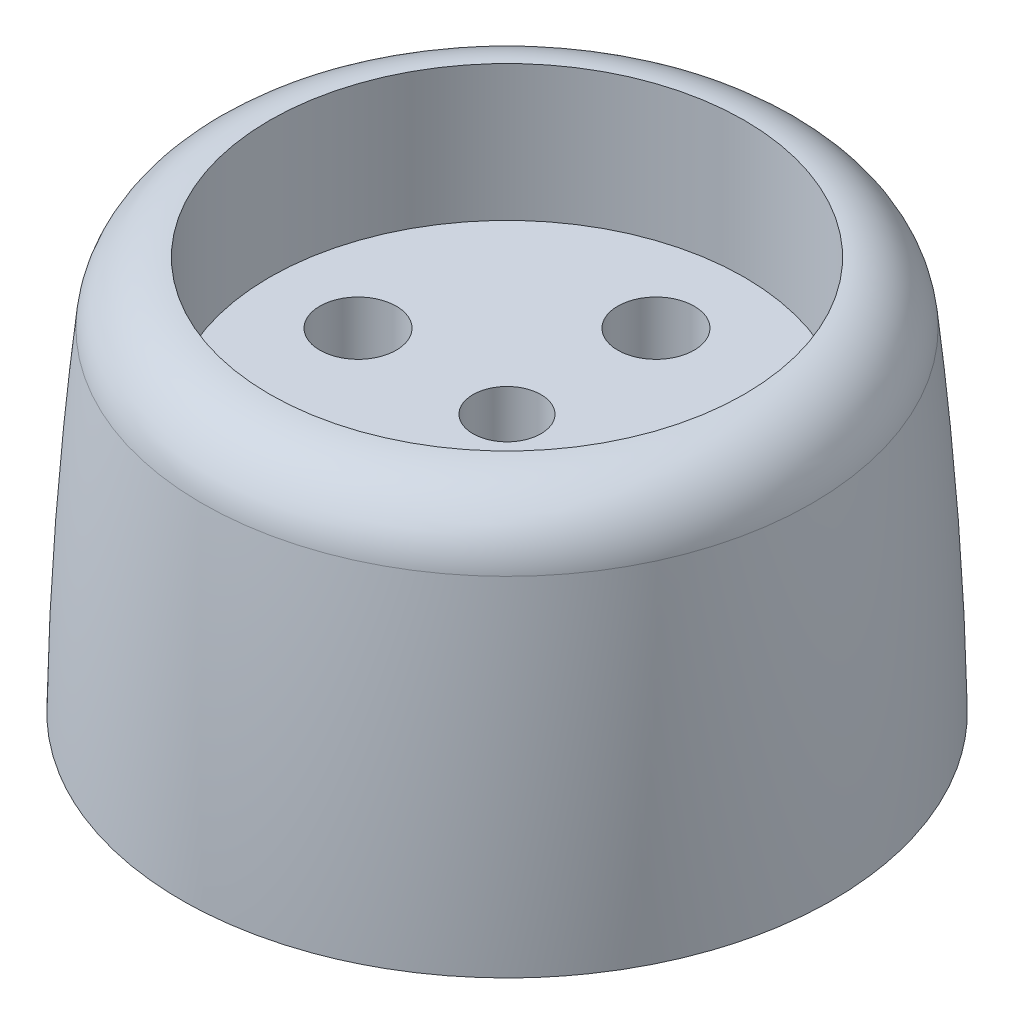
ISO-10303-21;
HEADER;
FILE_DESCRIPTION(('STEP AP214'),'2;1');
FILE_NAME('part.step','',(''),(''),'','','');
FILE_SCHEMA(('AUTOMOTIVE_DESIGN { 1 0 10303 214 1 1 1 1 }'));
ENDSEC;
DATA;
#1=APPLICATION_CONTEXT('core data for automotive mechanical design processes');
#2=APPLICATION_PROTOCOL_DEFINITION('international standard','automotive_design',2000,#1);
#3=PRODUCT_CONTEXT('',#1,'mechanical');
#4=PRODUCT('Part','Part','',(#3));
#5=PRODUCT_RELATED_PRODUCT_CATEGORY('part','',(#4));
#6=PRODUCT_DEFINITION_FORMATION('','',#4);
#7=PRODUCT_DEFINITION_CONTEXT('part definition',#1,'design');
#8=PRODUCT_DEFINITION('design','',#6,#7);
#9=PRODUCT_DEFINITION_SHAPE('','',#8);
#10=(LENGTH_UNIT() NAMED_UNIT(*) SI_UNIT(.MILLI.,.METRE.));
#11=(NAMED_UNIT(*) PLANE_ANGLE_UNIT() SI_UNIT($,.RADIAN.));
#12=(NAMED_UNIT(*) SI_UNIT($,.STERADIAN.) SOLID_ANGLE_UNIT());
#13=UNCERTAINTY_MEASURE_WITH_UNIT(LENGTH_MEASURE(1.E-05),#10,'distance_accuracy_value','');
#14=(GEOMETRIC_REPRESENTATION_CONTEXT(3) GLOBAL_UNCERTAINTY_ASSIGNED_CONTEXT((#13)) GLOBAL_UNIT_ASSIGNED_CONTEXT((#10,
#11,#12)) REPRESENTATION_CONTEXT('',''));
#15=CARTESIAN_POINT('',(0.,0.,0.));
#16=DIRECTION('',(0.,0.,1.));
#17=DIRECTION('',(1.,0.,0.));
#18=AXIS2_PLACEMENT_3D('',#15,#16,#17);
#19=CARTESIAN_POINT('',(0.,-21.59,0.));
#20=DIRECTION('',(0.,1.,0.));
#21=DIRECTION('',(0.,0.,1.));
#22=AXIS2_PLACEMENT_3D('',#19,#20,#21);
#23=CYLINDRICAL_SURFACE('',#22,1.5875);
#24=CARTESIAN_POINT('',(0.,3.17487659075111,0.));
#25=DIRECTION('',(0.,1.,0.));
#26=DIRECTION('',(0.,0.,1.));
#27=AXIS2_PLACEMENT_3D('',#24,#25,#26);
#28=CIRCLE('',#27,1.5875);
#29=CARTESIAN_POINT('',(0.,3.17487659075111,1.58749999999999));
#30=VERTEX_POINT('',#29);
#31=EDGE_CURVE('E859',#30,#30,#28,.F.);
#32=ORIENTED_EDGE('',*,*,#31,.T.);
#33=EDGE_LOOP('',(#32));
#34=FACE_BOUND('',#33,.T.);
#35=CARTESIAN_POINT('',(0.,15.24,0.));
#36=DIRECTION('',(0.,1.,0.));
#37=DIRECTION('',(-1.,0.,0.));
#38=AXIS2_PLACEMENT_3D('',#35,#36,#37);
#39=CIRCLE('',#38,1.5875);
#40=CARTESIAN_POINT('',(-1.5875,15.24,0.));
#41=VERTEX_POINT('',#40);
#42=EDGE_CURVE('E312',#41,#41,#39,.F.);
#43=ORIENTED_EDGE('',*,*,#42,.F.);
#44=EDGE_LOOP('',(#43));
#45=FACE_BOUND('',#44,.T.);
#46=ADVANCED_FACE('F56',(#34,#45),#23,.F.);
#47=CARTESIAN_POINT('',(-6.96215531705922,-21.59,0.));
#48=DIRECTION('',(0.,1.,0.));
#49=DIRECTION('',(0.,0.,1.));
#50=AXIS2_PLACEMENT_3D('',#47,#48,#49);
#51=CYLINDRICAL_SURFACE('',#50,1.7859375);
#52=CARTESIAN_POINT('',(-6.96215531705924,3.17487659075111,0.));
#53=DIRECTION('',(0.,1.,0.));
#54=DIRECTION('',(0.,0.,1.));
#55=AXIS2_PLACEMENT_3D('',#52,#53,#54);
#56=CIRCLE('',#55,1.7859375);
#57=CARTESIAN_POINT('',(-6.96215531705924,3.17487659075111,1.7859375));
#58=VERTEX_POINT('',#57);
#59=EDGE_CURVE('E1285',#58,#58,#56,.F.);
#60=ORIENTED_EDGE('',*,*,#59,.T.);
#61=EDGE_LOOP('',(#60));
#62=FACE_BOUND('',#61,.T.);
#63=CARTESIAN_POINT('',(-6.96215531705924,15.24,0.));
#64=DIRECTION('',(0.,1.,0.));
#65=DIRECTION('',(-1.,0.,0.));
#66=AXIS2_PLACEMENT_3D('',#63,#64,#65);
#67=CIRCLE('',#66,1.7859375);
#68=CARTESIAN_POINT('',(-8.74809281705924,15.24,0.));
#69=VERTEX_POINT('',#68);
#70=EDGE_CURVE('E835',#69,#69,#67,.F.);
#71=ORIENTED_EDGE('',*,*,#70,.F.);
#72=EDGE_LOOP('',(#71));
#73=FACE_BOUND('',#72,.T.);
#74=ADVANCED_FACE('F1273',(#62,#73),#51,.F.);
#75=CARTESIAN_POINT('',(0.,-21.59,6.96215531705923));
#76=DIRECTION('',(0.,1.,0.));
#77=DIRECTION('',(0.,0.,1.));
#78=AXIS2_PLACEMENT_3D('',#75,#76,#77);
#79=CYLINDRICAL_SURFACE('',#78,1.7859375);
#80=CARTESIAN_POINT('',(0.,3.17487659075111,6.96215531705924));
#81=DIRECTION('',(0.,1.,0.));
#82=DIRECTION('',(0.,0.,1.));
#83=AXIS2_PLACEMENT_3D('',#80,#81,#82);
#84=CIRCLE('',#83,1.7859375);
#85=CARTESIAN_POINT('',(0.,3.17487659075111,8.74809281705924));
#86=VERTEX_POINT('',#85);
#87=EDGE_CURVE('E1290',#86,#86,#84,.F.);
#88=ORIENTED_EDGE('',*,*,#87,.T.);
#89=EDGE_LOOP('',(#88));
#90=FACE_BOUND('',#89,.T.);
#91=CARTESIAN_POINT('',(0.,15.24,6.96215531705923));
#92=DIRECTION('',(0.,1.,0.));
#93=DIRECTION('',(-1.,0.,0.));
#94=AXIS2_PLACEMENT_3D('',#91,#92,#93);
#95=CIRCLE('',#94,1.7859375);
#96=CARTESIAN_POINT('',(-1.7859375,15.24,6.96215531705923));
#97=VERTEX_POINT('',#96);
#98=EDGE_CURVE('E841',#97,#97,#95,.F.);
#99=ORIENTED_EDGE('',*,*,#98,.F.);
#100=EDGE_LOOP('',(#99));
#101=FACE_BOUND('',#100,.T.);
#102=ADVANCED_FACE('F1278',(#90,#101),#79,.F.);
#103=CARTESIAN_POINT('',(6.96215531705922,-21.59,0.));
#104=DIRECTION('',(0.,1.,0.));
#105=DIRECTION('',(0.,0.,1.));
#106=AXIS2_PLACEMENT_3D('',#103,#104,#105);
#107=CYLINDRICAL_SURFACE('',#106,1.7859375);
#108=CARTESIAN_POINT('',(6.96215531705924,3.17487659075111,0.));
#109=DIRECTION('',(0.,1.,0.));
#110=DIRECTION('',(0.,0.,1.));
#111=AXIS2_PLACEMENT_3D('',#108,#109,#110);
#112=CIRCLE('',#111,1.7859375);
#113=CARTESIAN_POINT('',(6.96215531705924,3.17487659075111,1.7859375));
#114=VERTEX_POINT('',#113);
#115=EDGE_CURVE('E1296',#114,#114,#112,.F.);
#116=ORIENTED_EDGE('',*,*,#115,.T.);
#117=EDGE_LOOP('',(#116));
#118=FACE_BOUND('',#117,.T.);
#119=CARTESIAN_POINT('',(6.96215531705922,15.24,0.));
#120=DIRECTION('',(0.,1.,0.));
#121=DIRECTION('',(-1.,0.,0.));
#122=AXIS2_PLACEMENT_3D('',#119,#120,#121);
#123=CIRCLE('',#122,1.7859375);
#124=CARTESIAN_POINT('',(5.17621781705922,15.24,0.));
#125=VERTEX_POINT('',#124);
#126=EDGE_CURVE('E847',#125,#125,#123,.F.);
#127=ORIENTED_EDGE('',*,*,#126,.F.);
#128=EDGE_LOOP('',(#127));
#129=FACE_BOUND('',#128,.T.);
#130=ADVANCED_FACE('F1466',(#118,#129),#107,.F.);
#131=CARTESIAN_POINT('',(0.,-21.59,-6.96215531705923));
#132=DIRECTION('',(0.,1.,0.));
#133=DIRECTION('',(0.,0.,1.));
#134=AXIS2_PLACEMENT_3D('',#131,#132,#133);
#135=CYLINDRICAL_SURFACE('',#134,1.7859375);
#136=CARTESIAN_POINT('',(0.,3.17487659075111,-6.96215531705923));
#137=DIRECTION('',(0.,1.,0.));
#138=DIRECTION('',(0.,0.,1.));
#139=AXIS2_PLACEMENT_3D('',#136,#137,#138);
#140=CIRCLE('',#139,1.7859375);
#141=CARTESIAN_POINT('',(0.,3.17487659075111,-5.17621781705923));
#142=VERTEX_POINT('',#141);
#143=EDGE_CURVE('E1299',#142,#142,#140,.F.);
#144=ORIENTED_EDGE('',*,*,#143,.T.);
#145=EDGE_LOOP('',(#144));
#146=FACE_BOUND('',#145,.T.);
#147=CARTESIAN_POINT('',(0.,15.24,-6.96215531705923));
#148=DIRECTION('',(0.,1.,0.));
#149=DIRECTION('',(-1.,0.,0.));
#150=AXIS2_PLACEMENT_3D('',#147,#148,#149);
#151=CIRCLE('',#150,1.7859375);
#152=CARTESIAN_POINT('',(-1.78593750000001,15.24,-6.96215531705923));
#153=VERTEX_POINT('',#152);
#154=EDGE_CURVE('E853',#153,#153,#151,.F.);
#155=ORIENTED_EDGE('',*,*,#154,.F.);
#156=EDGE_LOOP('',(#155));
#157=FACE_BOUND('',#156,.T.);
#158=ADVANCED_FACE('F1474',(#146,#157),#135,.F.);
#159=CARTESIAN_POINT('',(15.2116495254516,3.175,0.));
#160=DIRECTION('',(0.,-1.,0.));
#161=DIRECTION('',(1.,0.,0.));
#162=AXIS2_PLACEMENT_3D('',#159,#160,#161);
#163=PLANE('',#162);
#164=CARTESIAN_POINT('',(-8.9437872692217,3.17487659075111,-9.01657747057653));
#165=CARTESIAN_POINT('',(-8.38318792405415,3.17487659075111,-9.57265113631113));
#166=CARTESIAN_POINT('',(-7.75758972340849,3.17487659075111,-10.0553369751226));
#167=CARTESIAN_POINT('',(-7.13242529113575,3.17487659075111,-10.5376881360997));
#168=CARTESIAN_POINT('',(-6.45181852373652,3.17487659075111,-10.9391058929316));
#169=B_SPLINE_CURVE_WITH_KNOTS('',2,(#164,#165,#166,#167,#168),.UNSPECIFIED.,.F.,.F.,(3,2,3),
(0.,0.5,1.),.UNSPECIFIED.);
#170=CARTESIAN_POINT('',(-8.94441971891657,3.17487659840805,-9.01595190643541));
#171=VERTEX_POINT('',#170);
#172=CARTESIAN_POINT('',(-6.45181852373651,3.17487659075111,-10.9391058929316));
#173=VERTEX_POINT('',#172);
#174=EDGE_CURVE('E603',#171,#173,#169,.T.);
#175=ORIENTED_EDGE('',*,*,#174,.F.);
#176=DIRECTION('',(-0.771561141497439,0.,-0.636155173626034));
#177=VECTOR('',#176,1.);
#178=CARTESIAN_POINT('',(-8.94179219241481,3.17499999999999,-9.01855600346696));
#179=LINE('',#178,#177);
#180=CARTESIAN_POINT('',(-10.8907253794166,3.17493829537555,-10.6200932290842));
#181=VERTEX_POINT('',#180);
#182=EDGE_CURVE('E283',#171,#181,#179,.T.);
#183=ORIENTED_EDGE('',*,*,#182,.T.);
#184=CARTESIAN_POINT('',(0.,3.175,0.));
#185=DIRECTION('',(0.,-1.,0.));
#186=DIRECTION('',(1.,0.,0.));
#187=AXIS2_PLACEMENT_3D('',#184,#185,#186);
#188=CIRCLE('',#187,15.2116495254516);
#189=CARTESIAN_POINT('',(-7.51043778140779,3.1748851959031,-13.2282868209953));
#190=VERTEX_POINT('',#189);
#191=EDGE_CURVE('E281',#181,#190,#188,.T.);
#192=ORIENTED_EDGE('',*,*,#191,.T.);
#193=DIRECTION('',(0.419135182780614,0.,0.90792383962283));
#194=VECTOR('',#193,1.);
#195=CARTESIAN_POINT('',(-6.44939814103546,3.17499999999999,-10.9405330591525));
#196=LINE('',#195,#194);
#197=EDGE_CURVE('E299',#190,#173,#196,.T.);
#198=ORIENTED_EDGE('',*,*,#197,.T.);
#199=EDGE_LOOP('',(#175,#183,#192,#198));
#200=FACE_BOUND('',#199,.T.);
#201=ADVANCED_FACE('F395',(#200),#163,.T.);
#202=DIRECTION('',(0.771561141497439,0.,0.636155173626034));
#203=VECTOR('',#202,1.);
#204=CARTESIAN_POINT('',(-10.5576263334249,3.17499999999999,-7.05879070406347));
#205=LINE('',#204,#203);
#206=CARTESIAN_POINT('',(-12.5062091733793,3.17488519590341,-8.65961777439389));
#207=VERTEX_POINT('',#206);
#208=CARTESIAN_POINT('',(-10.5596807089745,3.17487659075111,-7.05571420539032));
#209=VERTEX_POINT('',#208);
#210=EDGE_CURVE('E257',#207,#209,#205,.T.);
#211=ORIENTED_EDGE('',*,*,#210,.T.);
#212=CARTESIAN_POINT('',(-11.9702202376876,3.17487659075111,-4.24309173377785));
#213=CARTESIAN_POINT('',(-11.7064090016404,3.17487659075111,-4.987331734889));
#214=CARTESIAN_POINT('',(-11.352194035604,3.17487659075111,-5.69365353512118));
#215=CARTESIAN_POINT('',(-10.9982246701013,3.17487659075111,-6.39948559599223));
#216=CARTESIAN_POINT('',(-10.5591877986707,3.17487659075111,-7.05645470703267));
#217=B_SPLINE_CURVE_WITH_KNOTS('',2,(#212,#213,#214,#215,#216),.UNSPECIFIED.,.F.,.F.,(3,2,3),
(0.,0.5,1.),.UNSPECIFIED.);
#218=CARTESIAN_POINT('',(-11.9702202376876,3.17487659075111,-4.24309173377786));
#219=VERTEX_POINT('',#218);
#220=EDGE_CURVE('E74',#219,#209,#217,.T.);
#221=ORIENTED_EDGE('',*,*,#220,.F.);
#222=DIRECTION('',(-0.971169953564289,0.,-0.238388173561394));
#223=VECTOR('',#222,1.);
#224=CARTESIAN_POINT('',(-11.969281188844,3.17499999999999,-4.24573996170106));
#225=LINE('',#224,#223);
#226=CARTESIAN_POINT('',(-14.4200902757408,3.17493829537555,-4.84306472430372));
#227=VERTEX_POINT('',#226);
#228=EDGE_CURVE('E269',#219,#227,#225,.T.);
#229=ORIENTED_EDGE('',*,*,#228,.T.);
#230=EDGE_CURVE('E279',#227,#207,#188,.T.);
#231=ORIENTED_EDGE('',*,*,#230,.T.);
#232=EDGE_LOOP('',(#211,#221,#229,#231));
#233=FACE_BOUND('',#232,.T.);
#234=ADVANCED_FACE('F288',(#233),#163,.T.);
#235=CARTESIAN_POINT('',(-12.6258042829624,3.17487659075111,1.37079035900065));
#236=CARTESIAN_POINT('',(-12.7110322067656,3.17487659075111,0.585789882219289));
#237=CARTESIAN_POINT('',(-12.698357093525,3.17487659075111,-0.204272184410827));
#238=CARTESIAN_POINT('',(-12.6856907687736,3.17487659075111,-0.993786449075516));
#239=CARTESIAN_POINT('',(-12.5751804301384,3.17487659075111,-1.77618612466817));
#240=B_SPLINE_CURVE_WITH_KNOTS('',2,(#235,#236,#237,#238,#239),.UNSPECIFIED.,.F.,.F.,(3,2,3),
(0.,0.5,1.),.UNSPECIFIED.);
#241=CARTESIAN_POINT('',(-12.6258042829624,3.17487659075111,1.37079035900065));
#242=VERTEX_POINT('',#241);
#243=CARTESIAN_POINT('',(-12.5753032353554,3.17487659075111,-1.7753050899761));
#244=VERTEX_POINT('',#243);
#245=EDGE_CURVE('E1161',#242,#244,#240,.T.);
#246=ORIENTED_EDGE('',*,*,#245,.F.);
#247=DIRECTION('',(-0.978426645709885,0.,0.206594527916166));
#248=VECTOR('',#247,1.);
#249=CARTESIAN_POINT('',(-12.6261072522222,3.17499999999999,1.36799695006323));
#250=LINE('',#249,#248);
#251=CARTESIAN_POINT('',(-15.0933794421539,3.17493829537555,1.89319214541851));
#252=VERTEX_POINT('',#251);
#253=EDGE_CURVE('E807',#242,#252,#250,.T.);
#254=ORIENTED_EDGE('',*,*,#253,.T.);
#255=CARTESIAN_POINT('',(-15.0248149332712,3.1748851959031,-2.37680850436307));
#256=VERTEX_POINT('',#255);
#257=EDGE_CURVE('E291',#252,#256,#188,.T.);
#258=ORIENTED_EDGE('',*,*,#257,.T.);
#259=DIRECTION('',(0.971169953564289,0.,0.238388173561394));
#260=VECTOR('',#259,1.);
#261=CARTESIAN_POINT('',(-12.5747871496899,3.17499999999999,-1.77896827964777));
#262=LINE('',#261,#260);
#263=EDGE_CURVE('E812',#256,#244,#262,.T.);
#264=ORIENTED_EDGE('',*,*,#263,.T.);
#265=EDGE_LOOP('',(#246,#254,#258,#264));
#266=FACE_BOUND('',#265,.T.);
#267=ADVANCED_FACE('F1166',(#266),#163,.T.);
#268=CARTESIAN_POINT('',(-10.7806929446686,3.17487659075111,6.71317060953857));
#269=CARTESIAN_POINT('',(-11.198079592762,3.17487659075111,6.04288862893386));
#270=CARTESIAN_POINT('',(-11.5294547939437,3.17487659075111,5.32556777765602));
#271=CARTESIAN_POINT('',(-11.8606002309089,3.17487659075111,4.60874429209195));
#272=CARTESIAN_POINT('',(-12.1005043529502,3.17487659075111,3.85587790318016));
#273=B_SPLINE_CURVE_WITH_KNOTS('',2,(#268,#269,#270,#271,#272),.UNSPECIFIED.,.F.,.F.,(3,2,3),
(0.,0.5,1.),.UNSPECIFIED.);
#274=CARTESIAN_POINT('',(-10.7806929446686,3.17487659075111,6.71317060953858));
#275=VERTEX_POINT('',#274);
#276=CARTESIAN_POINT('',(-12.100232730001,3.17487659075111,3.85672497119596));
#277=VERTEX_POINT('',#276);
#278=EDGE_CURVE('E1252',#275,#277,#273,.T.);
#279=ORIENTED_EDGE('',*,*,#278,.F.);
#280=DIRECTION('',(-0.791893941057303,0.,0.610658649424318));
#281=VECTOR('',#280,1.);
#282=CARTESIAN_POINT('',(-10.7821779252543,3.17499999999999,6.71078528848594));
#283=LINE('',#282,#281);
#284=CARTESIAN_POINT('',(-12.7772397018969,3.17493829537555,8.2544790922613));
#285=VERTEX_POINT('',#284);
#286=EDGE_CURVE('E791',#275,#285,#283,.T.);
#287=ORIENTED_EDGE('',*,*,#286,.T.);
#288=CARTESIAN_POINT('',(-14.5681490619122,3.1748851959031,4.37759241540021));
#289=VERTEX_POINT('',#288);
#290=EDGE_CURVE('E297',#285,#289,#188,.T.);
#291=ORIENTED_EDGE('',*,*,#290,.T.);
#292=DIRECTION('',(0.978426645709885,0.,-0.206594527916166));
#293=VECTOR('',#292,1.);
#294=CARTESIAN_POINT('',(-12.1013571513151,3.17499999999999,3.85320063016637));
#295=LINE('',#294,#293);
#296=EDGE_CURVE('E378',#289,#277,#295,.T.);
#297=ORIENTED_EDGE('',*,*,#296,.T.);
#298=EDGE_LOOP('',(#279,#287,#291,#297));
#299=FACE_BOUND('',#298,.T.);
#300=ADVANCED_FACE('F1237',(#299),#163,.T.);
#301=CARTESIAN_POINT('',(-6.80033315216099,3.17487659075111,10.7259250892229));
#302=CARTESIAN_POINT('',(-7.4672099799845,3.17487659075111,10.3031191715111));
#303=CARTESIAN_POINT('',(-8.07700257293823,3.17487659075111,9.80061372755551));
#304=CARTESIAN_POINT('',(-8.68637235659993,3.17487659075111,9.29845670365854));
#305=CARTESIAN_POINT('',(-9.22917498571327,3.17487659075111,8.72423802306452));
#306=B_SPLINE_CURVE_WITH_KNOTS('',2,(#301,#302,#303,#304,#305),.UNSPECIFIED.,.F.,.F.,(3,2,3),
(0.,0.5,1.),.UNSPECIFIED.);
#307=CARTESIAN_POINT('',(-6.80033315216098,3.17487659075111,10.7259250892229));
#308=VERTEX_POINT('',#307);
#309=CARTESIAN_POINT('',(-9.22856273285427,3.17487659075111,8.72488335219496));
#310=VERTEX_POINT('',#309);
#311=EDGE_CURVE('E1239',#308,#310,#306,.T.);
#312=ORIENTED_EDGE('',*,*,#311,.F.);
#313=DIRECTION('',(-0.448516929436481,0.,0.893774336177131));
#314=VECTOR('',#313,1.);
#315=CARTESIAN_POINT('',(-6.80270602545542,3.17499999999999,10.7244202981435));
#316=LINE('',#315,#314);
#317=CARTESIAN_POINT('',(-7.93041093611782,3.17493829537556,12.9808652203392));
#318=VERTEX_POINT('',#317);
#319=EDGE_CURVE('E773',#308,#318,#316,.T.);
#320=ORIENTED_EDGE('',*,*,#319,.T.);
#321=CARTESIAN_POINT('',(-11.2260826022182,3.1748851959031,10.2649574696457));
#322=VERTEX_POINT('',#321);
#323=EDGE_CURVE('E361',#318,#322,#188,.T.);
#324=ORIENTED_EDGE('',*,*,#323,.T.);
#325=DIRECTION('',(0.791893941057303,0.,-0.610658649424319));
#326=VECTOR('',#325,1.);
#327=CARTESIAN_POINT('',(-9.23110495571652,3.17499999999999,8.7221958987715));
#328=LINE('',#327,#326);
#329=EDGE_CURVE('E779',#322,#310,#328,.T.);
#330=ORIENTED_EDGE('',*,*,#329,.T.);
#331=EDGE_LOOP('',(#312,#320,#324,#330));
#332=FACE_BOUND('',#331,.T.);
#333=ADVANCED_FACE('F1240',(#332),#163,.T.);
#334=CARTESIAN_POINT('',(-1.47308397825492,3.17487659075111,12.614278560148));
#335=CARTESIAN_POINT('',(-2.25736785134257,3.17487659075111,12.5226906027123));
#336=CARTESIAN_POINT('',(-3.02480093442641,3.17487659075111,12.3345279320732));
#337=CARTESIAN_POINT('',(-3.79170190569422,3.17487659075111,12.1464957269855));
#338=CARTESIAN_POINT('',(-4.52989432415259,3.17487659075111,11.8646558067232));
#339=B_SPLINE_CURVE_WITH_KNOTS('',2,(#334,#335,#336,#337,#338),.UNSPECIFIED.,.F.,.F.,(3,2,3),
(0.,0.5,1.),.UNSPECIFIED.);
#340=CARTESIAN_POINT('',(-1.47308397825492,3.17487659075111,12.614278560148));
#341=VERTEX_POINT('',#340);
#342=CARTESIAN_POINT('',(-4.52906270557128,3.17487659075111,11.8649715816195));
#343=VERTEX_POINT('',#342);
#344=EDGE_CURVE('E1302',#341,#343,#339,.T.);
#345=ORIENTED_EDGE('',*,*,#344,.F.);
#346=DIRECTION('',(-0.0163056392416079,0.,0.999867054227172));
#347=VECTOR('',#346,1.);
#348=CARTESIAN_POINT('',(-1.47587476760079,3.17499999999999,12.6139523413702));
#349=LINE('',#348,#347);
#350=CARTESIAN_POINT('',(-1.5128670243332,3.17493829537555,15.1362317916645));
#351=VERTEX_POINT('',#350);
#352=EDGE_CURVE('E756',#341,#351,#349,.T.);
#353=ORIENTED_EDGE('',*,*,#352,.T.);
#354=CARTESIAN_POINT('',(-5.66055280428693,3.1748851959031,14.1192218055862));
#355=VERTEX_POINT('',#354);
#356=EDGE_CURVE('E356',#351,#355,#188,.T.);
#357=ORIENTED_EDGE('',*,*,#356,.T.);
#358=DIRECTION('',(0.448516929436481,0.,-0.893774336177131));
#359=VECTOR('',#358,1.);
#360=CARTESIAN_POINT('',(-4.53251921156551,3.17499999999999,11.8636532989122));
#361=LINE('',#360,#359);
#362=EDGE_CURVE('E761',#355,#343,#361,.T.);
#363=ORIENTED_EDGE('',*,*,#362,.T.);
#364=EDGE_LOOP('',(#345,#353,#357,#363));
#365=FACE_BOUND('',#364,.T.);
#366=ADVANCED_FACE('F1315',(#365),#163,.T.);
#367=CARTESIAN_POINT('',(4.14592754373402,3.17487659075111,12.0042194582617));
#368=CARTESIAN_POINT('',(3.39957366505523,3.17487659075111,12.2619895793217));
#369=CARTESIAN_POINT('',(2.62649962589758,3.17487659075111,12.4254376065859));
#370=CARTESIAN_POINT('',(1.85396160980473,3.17487659075111,12.5887723045854));
#371=CARTESIAN_POINT('',(1.06658746381457,3.17487659075111,12.655132997406));
#372=B_SPLINE_CURVE_WITH_KNOTS('',2,(#367,#368,#369,#370,#371),.UNSPECIFIED.,.F.,.F.,(3,2,3),
(0.,0.5,1.),.UNSPECIFIED.);
#373=CARTESIAN_POINT('',(4.14676878332822,3.17487659840805,12.003930254084));
#374=VERTEX_POINT('',#373);
#375=CARTESIAN_POINT('',(1.06658746381458,3.17487659075111,12.655132997406));
#376=VERTEX_POINT('',#375);
#377=EDGE_CURVE('E1247',#374,#376,#372,.T.);
#378=ORIENTED_EDGE('',*,*,#377,.F.);
#379=DIRECTION('',(0.419135182780614,0.,0.90792383962283));
#380=VECTOR('',#379,1.);
#381=CARTESIAN_POINT('',(4.14327158839348,3.17499999999999,12.0051364234153));
#382=LINE('',#381,#380);
#383=CARTESIAN_POINT('',(5.20431875571716,3.17493829537556,14.2936820229498));
#384=VERTEX_POINT('',#383);
#385=EDGE_CURVE('E740',#374,#384,#382,.T.);
#386=ORIENTED_EDGE('',*,*,#385,.T.);
#387=CARTESIAN_POINT('',(1.02713207735344,3.17488519590311,15.1769314284076));
#388=VERTEX_POINT('',#387);
#389=EDGE_CURVE('E351',#384,#388,#188,.T.);
#390=ORIENTED_EDGE('',*,*,#389,.T.);
#391=DIRECTION('',(0.0163056392416076,0.,-0.999867054227172));
#392=VECTOR('',#391,1.);
#393=CARTESIAN_POINT('',(1.06378755013622,3.17499999999999,12.6553686650439));
#394=LINE('',#393,#392);
#395=EDGE_CURVE('E746',#388,#376,#394,.T.);
#396=ORIENTED_EDGE('',*,*,#395,.T.);
#397=EDGE_LOOP('',(#378,#386,#390,#396));
#398=FACE_BOUND('',#397,.T.);
#399=ADVANCED_FACE('F1312',(#398),#163,.T.);
#400=CARTESIAN_POINT('',(8.94378726922175,3.17487659075111,9.01657747057646));
#401=CARTESIAN_POINT('',(8.38318792405061,3.17487659075111,9.57265113631463));
#402=CARTESIAN_POINT('',(7.75758972340851,3.17487659075111,10.0553369751225));
#403=CARTESIAN_POINT('',(7.1324252911314,3.17487659075111,10.5376881361023));
#404=CARTESIAN_POINT('',(6.45181852373651,3.17487659075111,10.9391058929316));
#405=B_SPLINE_CURVE_WITH_KNOTS('',2,(#400,#401,#402,#403,#404),.UNSPECIFIED.,.F.,.F.,(3,2,3),
(0.,0.5,1.),.UNSPECIFIED.);
#406=CARTESIAN_POINT('',(8.94441971891662,3.17487659840806,9.01595190643536));
#407=VERTEX_POINT('',#406);
#408=CARTESIAN_POINT('',(6.45181852373651,3.17487659075111,10.9391058929316));
#409=VERTEX_POINT('',#408);
#410=EDGE_CURVE('E1242',#407,#409,#405,.T.);
#411=ORIENTED_EDGE('',*,*,#410,.F.);
#412=DIRECTION('',(0.771561141497443,0.,0.636155173626029));
#413=VECTOR('',#412,1.);
#414=CARTESIAN_POINT('',(8.94179219241485,3.175,9.01855600346691));
#415=LINE('',#414,#413);
#416=CARTESIAN_POINT('',(10.8907253794167,3.17493829537556,10.6200932290841));
#417=VERTEX_POINT('',#416);
#418=EDGE_CURVE('E722',#407,#417,#415,.T.);
#419=ORIENTED_EDGE('',*,*,#418,.T.);
#420=CARTESIAN_POINT('',(7.51043778140778,3.17488519590311,13.2282868209953));
#421=VERTEX_POINT('',#420);
#422=EDGE_CURVE('E346',#417,#421,#188,.T.);
#423=ORIENTED_EDGE('',*,*,#422,.T.);
#424=DIRECTION('',(-0.419135182780614,0.,-0.90792383962283));
#425=VECTOR('',#424,1.);
#426=CARTESIAN_POINT('',(6.44939814103544,3.17499999999999,10.9405330591525));
#427=LINE('',#426,#425);
#428=EDGE_CURVE('E728',#421,#409,#427,.T.);
#429=ORIENTED_EDGE('',*,*,#428,.T.);
#430=EDGE_LOOP('',(#411,#419,#423,#429));
#431=FACE_BOUND('',#430,.T.);
#432=ADVANCED_FACE('F1314',(#431),#163,.T.);
#433=CARTESIAN_POINT('',(11.9702202376876,3.17487659075111,4.24309173377776));
#434=CARTESIAN_POINT('',(11.7064090016375,3.17487659075111,4.98733173489722));
#435=CARTESIAN_POINT('',(11.352194035604,3.17487659075111,5.6936535351211));
#436=CARTESIAN_POINT('',(10.9982246700964,3.17487659075111,6.39948559599949));
#437=CARTESIAN_POINT('',(10.5591877986708,3.17487659075111,7.05645470703259));
#438=B_SPLINE_CURVE_WITH_KNOTS('',2,(#433,#434,#435,#436,#437),.UNSPECIFIED.,.F.,.F.,(3,2,3),
(0.,0.5,1.),.UNSPECIFIED.);
#439=CARTESIAN_POINT('',(11.9705186330646,3.17487659840806,4.24225371032334));
#440=VERTEX_POINT('',#439);
#441=CARTESIAN_POINT('',(10.5591877986708,3.17487659075111,7.05645470703259));
#442=VERTEX_POINT('',#441);
#443=EDGE_CURVE('E1243',#440,#442,#438,.T.);
#444=ORIENTED_EDGE('',*,*,#443,.F.);
#445=DIRECTION('',(0.97116995356429,0.,0.238388173561387));
#446=VECTOR('',#445,1.);
#447=CARTESIAN_POINT('',(11.969281188844,3.17499999999999,4.24573996170098));
#448=LINE('',#447,#446);
#449=CARTESIAN_POINT('',(14.4200902757413,3.17493829537556,4.84306472430228));
#450=VERTEX_POINT('',#449);
#451=EDGE_CURVE('E704',#440,#450,#448,.T.);
#452=ORIENTED_EDGE('',*,*,#451,.T.);
#453=CARTESIAN_POINT('',(12.5062091733794,3.17488519590311,8.65961777439372));
#454=VERTEX_POINT('',#453);
#455=EDGE_CURVE('E341',#450,#454,#188,.T.);
#456=ORIENTED_EDGE('',*,*,#455,.T.);
#457=DIRECTION('',(-0.771561141497443,0.,-0.636155173626029));
#458=VECTOR('',#457,1.);
#459=CARTESIAN_POINT('',(10.557626333425,3.17499999999999,7.05879070406339));
#460=LINE('',#459,#458);
#461=EDGE_CURVE('E710',#454,#442,#460,.T.);
#462=ORIENTED_EDGE('',*,*,#461,.T.);
#463=EDGE_LOOP('',(#444,#452,#456,#462));
#464=FACE_BOUND('',#463,.T.);
#465=ADVANCED_FACE('F1320',(#464),#163,.T.);
#466=CARTESIAN_POINT('',(12.6258042829624,3.17487659075111,-1.37079035900073));
#467=CARTESIAN_POINT('',(12.7110322067642,3.17487659075111,-0.585789882232075));
#468=CARTESIAN_POINT('',(12.698357093525,3.17487659075111,0.204272184410737));
#469=CARTESIAN_POINT('',(12.6856907687753,3.17487659075111,0.993786449062789));
#470=CARTESIAN_POINT('',(12.5751804301384,3.17487659075111,1.77618612466806));
#471=B_SPLINE_CURVE_WITH_KNOTS('',2,(#466,#467,#468,#469,#470),.UNSPECIFIED.,.F.,.F.,(3,2,3),
(0.,0.5,1.),.UNSPECIFIED.);
#472=CARTESIAN_POINT('',(12.6257095231575,3.17487659840806,-1.37167486094565));
#473=VERTEX_POINT('',#472);
#474=CARTESIAN_POINT('',(12.5751804301384,3.17487659075111,1.77618612466805));
#475=VERTEX_POINT('',#474);
#476=EDGE_CURVE('E1248',#473,#475,#471,.T.);
#477=ORIENTED_EDGE('',*,*,#476,.F.);
#478=DIRECTION('',(0.978426645709884,0.,-0.206594527916172));
#479=VECTOR('',#478,1.);
#480=CARTESIAN_POINT('',(12.6261072522222,3.175,-1.36799695006333));
#481=LINE('',#480,#479);
#482=CARTESIAN_POINT('',(15.0933794421539,3.17493829537556,-1.8931921454186));
#483=VERTEX_POINT('',#482);
#484=EDGE_CURVE('E686',#473,#483,#481,.T.);
#485=ORIENTED_EDGE('',*,*,#484,.T.);
#486=CARTESIAN_POINT('',(15.0249724599734,3.17488519590311,2.37580522433099));
#487=VERTEX_POINT('',#486);
#488=EDGE_CURVE('E336',#483,#487,#188,.T.);
#489=ORIENTED_EDGE('',*,*,#488,.T.);
#490=DIRECTION('',(-0.971169953564291,0.,-0.238388173561387));
#491=VECTOR('',#490,1.);
#492=CARTESIAN_POINT('',(12.57478714969,3.175,1.77896827964767));
#493=LINE('',#492,#491);
#494=EDGE_CURVE('E692',#487,#475,#493,.T.);
#495=ORIENTED_EDGE('',*,*,#494,.T.);
#496=EDGE_LOOP('',(#477,#485,#489,#495));
#497=FACE_BOUND('',#496,.T.);
#498=ADVANCED_FACE('F1271',(#497),#163,.T.);
#499=CARTESIAN_POINT('',(10.7806929446686,3.17487659075111,-6.71317060953864));
#500=CARTESIAN_POINT('',(11.1980795927523,3.17487659075111,-6.04288862894939));
#501=CARTESIAN_POINT('',(11.5294547939437,3.17487659075111,-5.3255677776561));
#502=CARTESIAN_POINT('',(11.8606002309033,3.17487659075111,-4.60874429210939));
#503=CARTESIAN_POINT('',(12.1005043529502,3.17487659075111,-3.85587790318025));
#504=B_SPLINE_CURVE_WITH_KNOTS('',2,(#499,#500,#501,#502,#503),.UNSPECIFIED.,.F.,.F.,(3,2,3),
(0.,0.5,1.),.UNSPECIFIED.);
#505=CARTESIAN_POINT('',(10.7802237980233,3.17487659840806,-6.71392640351615));
#506=VERTEX_POINT('',#505);
#507=CARTESIAN_POINT('',(12.1005043529502,3.17487659075111,-3.85587790318023));
#508=VERTEX_POINT('',#507);
#509=EDGE_CURVE('E1256',#506,#508,#504,.T.);
#510=ORIENTED_EDGE('',*,*,#509,.F.);
#511=DIRECTION('',(0.791893941057299,0.,-0.610658649424324));
#512=VECTOR('',#511,1.);
#513=CARTESIAN_POINT('',(10.7821779252542,3.17499999999999,-6.71078528848601));
#514=LINE('',#513,#512);
#515=CARTESIAN_POINT('',(12.7772397018968,3.17493829537556,-8.25447909226138));
#516=VERTEX_POINT('',#515);
#517=EDGE_CURVE('E668',#506,#516,#514,.T.);
#518=ORIENTED_EDGE('',*,*,#517,.T.);
#519=CARTESIAN_POINT('',(14.567855681675,3.17488519590311,-4.37856468774945));
#520=VERTEX_POINT('',#519);
#521=EDGE_CURVE('E331',#516,#520,#188,.T.);
#522=ORIENTED_EDGE('',*,*,#521,.T.);
#523=DIRECTION('',(-0.978426645709884,0.,0.206594527916172));
#524=VECTOR('',#523,1.);
#525=CARTESIAN_POINT('',(12.1013571513151,3.175,-3.85320063016644));
#526=LINE('',#525,#524);
#527=EDGE_CURVE('E674',#520,#508,#526,.T.);
#528=ORIENTED_EDGE('',*,*,#527,.T.);
#529=EDGE_LOOP('',(#510,#518,#522,#528));
#530=FACE_BOUND('',#529,.T.);
#531=ADVANCED_FACE('F1266',(#530),#163,.T.);
#532=CARTESIAN_POINT('',(6.8003331521609,3.17487659075111,-10.7259250892229));
#533=CARTESIAN_POINT('',(7.4672099799833,3.17487659075111,-10.3031191715119));
#534=CARTESIAN_POINT('',(8.07700257293814,3.17487659075111,-9.80061372755557));
#535=CARTESIAN_POINT('',(8.68637235659894,3.17487659075111,-9.29845670365957));
#536=CARTESIAN_POINT('',(9.2291749857132,3.17487659075111,-8.72423802306458));
#537=B_SPLINE_CURVE_WITH_KNOTS('',2,(#532,#533,#534,#535,#536),.UNSPECIFIED.,.F.,.F.,(3,2,3),
(0.,0.5,1.),.UNSPECIFIED.);
#538=CARTESIAN_POINT('',(6.7995825389221,3.17487659840806,-10.7264024809666));
#539=VERTEX_POINT('',#538);
#540=CARTESIAN_POINT('',(9.2291749857132,3.17487659075111,-8.72423802306459));
#541=VERTEX_POINT('',#540);
#542=EDGE_CURVE('E1164',#539,#541,#537,.T.);
#543=ORIENTED_EDGE('',*,*,#542,.F.);
#544=DIRECTION('',(0.448516929436475,0.,-0.893774336177134));
#545=VECTOR('',#544,1.);
#546=CARTESIAN_POINT('',(6.80270602545535,3.17499999999999,-10.7244202981436));
#547=LINE('',#546,#545);
#548=CARTESIAN_POINT('',(7.93041093611775,3.17493829537556,-12.9808652203392));
#549=VERTEX_POINT('',#548);
#550=EDGE_CURVE('E650',#539,#549,#547,.T.);
#551=ORIENTED_EDGE('',*,*,#550,.T.);
#552=CARTESIAN_POINT('',(11.2253964225957,3.17488519590311,-10.2657061638492));
#553=VERTEX_POINT('',#552);
#554=EDGE_CURVE('E326',#549,#553,#188,.T.);
#555=ORIENTED_EDGE('',*,*,#554,.T.);
#556=DIRECTION('',(-0.791893941057299,0.,0.610658649424324));
#557=VECTOR('',#556,1.);
#558=CARTESIAN_POINT('',(9.23110495571648,3.175,-8.72219589877155));
#559=LINE('',#558,#557);
#560=EDGE_CURVE('E656',#553,#541,#559,.T.);
#561=ORIENTED_EDGE('',*,*,#560,.T.);
#562=EDGE_LOOP('',(#543,#551,#555,#561));
#563=FACE_BOUND('',#562,.T.);
#564=ADVANCED_FACE('F1264',(#563),#163,.T.);
#565=DIRECTION('',(0.0163056392416011,0.,-0.999867054227172));
#566=VECTOR('',#565,1.);
#567=CARTESIAN_POINT('',(1.47587476760071,3.17499999999999,-12.6139523413702));
#568=LINE('',#567,#566);
#569=CARTESIAN_POINT('',(1.47220056658007,3.17487659840805,-12.6143829963681));
#570=VERTEX_POINT('',#569);
#571=CARTESIAN_POINT('',(1.5128670243314,3.17493829537556,-15.1362317916646));
#572=VERTEX_POINT('',#571);
#573=EDGE_CURVE('E632',#570,#572,#568,.T.);
#574=ORIENTED_EDGE('',*,*,#573,.T.);
#575=CARTESIAN_POINT('',(5.65960973156882,3.17488519590311,-14.1195986335748));
#576=VERTEX_POINT('',#575);
#577=EDGE_CURVE('E321',#572,#576,#188,.T.);
#578=ORIENTED_EDGE('',*,*,#577,.T.);
#579=DIRECTION('',(-0.448516929436475,0.,0.893774336177134));
#580=VECTOR('',#579,1.);
#581=CARTESIAN_POINT('',(4.53251921156543,3.175,-11.8636532989122));
#582=LINE('',#581,#580);
#583=CARTESIAN_POINT('',(4.52989432415249,3.17487659075111,-11.8646558067232));
#584=VERTEX_POINT('',#583);
#585=EDGE_CURVE('E638',#576,#584,#582,.T.);
#586=ORIENTED_EDGE('',*,*,#585,.T.);
#587=CARTESIAN_POINT('',(1.47308397825482,3.17487659075111,-12.614278560148));
#588=CARTESIAN_POINT('',(2.25736785134251,3.17487659075111,-12.5226906027123));
#589=CARTESIAN_POINT('',(3.02480093442632,3.17487659075111,-12.3345279320732));
#590=CARTESIAN_POINT('',(3.79170190569415,3.17487659075111,-12.1464957269856));
#591=CARTESIAN_POINT('',(4.52989432415249,3.17487659075111,-11.8646558067232));
#592=B_SPLINE_CURVE_WITH_KNOTS('',2,(#587,#588,#589,#590,#591),.UNSPECIFIED.,.F.,.F.,(3,2,3),
(0.,0.5,1.),.UNSPECIFIED.);
#593=EDGE_CURVE('E1165',#570,#584,#592,.T.);
#594=ORIENTED_EDGE('',*,*,#593,.F.);
#595=EDGE_LOOP('',(#574,#578,#586,#594));
#596=FACE_BOUND('',#595,.T.);
#597=ADVANCED_FACE('F396',(#596),#163,.T.);
#598=CARTESIAN_POINT('',(0.,0.,0.));
#599=DIRECTION('',(0.,-1.,0.));
#600=DIRECTION('',(1.,0.,0.));
#601=AXIS2_PLACEMENT_3D('',#598,#599,#600);
#602=DEGENERATE_TOROIDAL_SURFACE('',#601,162.56,177.8,.F.);
#603=CARTESIAN_POINT('',(0.,18.7498181818182,0.));
#604=DIRECTION('',(0.,-1.,0.));
#605=DIRECTION('',(1.,0.,0.));
#606=AXIS2_PLACEMENT_3D('',#603,#604,#605);
#607=CIRCLE('',#606,14.2486092874122);
#608=CARTESIAN_POINT('',(14.2486092874122,18.7498181818182,0.));
#609=VERTEX_POINT('',#608);
#610=EDGE_CURVE('E13',#609,#609,#607,.T.);
#611=ORIENTED_EDGE('',*,*,#610,.T.);
#612=EDGE_LOOP('',(#611));
#613=FACE_BOUND('',#612,.T.);
#614=CARTESIAN_POINT('',(-7.51132146286101,3.17487659075111,-13.22778632904));
#615=CARTESIAN_POINT('',(-6.40308234857768,3.17487659075111,-13.8570934585952));
#616=CARTESIAN_POINT('',(-5.20557973596876,3.17487659075111,-14.2932229009991));
#617=B_SPLINE_CURVE_WITH_KNOTS('',2,(#614,#615,#616),.UNSPECIFIED.,.F.,.F.,(3,3),(0.,1.),.UNSPECIFIED.);
#618=CARTESIAN_POINT('',(-5.20431875571715,3.17493829537556,-14.2936820229498));
#619=VERTEX_POINT('',#618);
#620=EDGE_CURVE('E66',#190,#619,#617,.T.);
#621=ORIENTED_EDGE('',*,*,#620,.F.);
#622=ORIENTED_EDGE('',*,*,#191,.F.);
#623=CARTESIAN_POINT('',(0.,3.175,0.));
#624=DIRECTION('',(0.,1.,0.));
#625=DIRECTION('',(-0.636155173626034,0.,0.771561141497439));
#626=AXIS2_PLACEMENT_3D('',#623,#624,#625);
#627=CIRCLE('',#626,15.2116495254516);
#628=EDGE_CURVE('E262',#181,#207,#627,.T.);
#629=ORIENTED_EDGE('',*,*,#628,.T.);
#630=ORIENTED_EDGE('',*,*,#230,.F.);
#631=CARTESIAN_POINT('',(0.,3.175,0.));
#632=DIRECTION('',(0.,1.,0.));
#633=DIRECTION('',(-0.238388173561394,0.,0.971169953564289));
#634=AXIS2_PLACEMENT_3D('',#631,#632,#633);
#635=CIRCLE('',#634,15.2116495254516);
#636=EDGE_CURVE('E817',#227,#256,#635,.T.);
#637=ORIENTED_EDGE('',*,*,#636,.T.);
#638=ORIENTED_EDGE('',*,*,#257,.F.);
#639=CARTESIAN_POINT('',(0.,3.175,0.));
#640=DIRECTION('',(0.,1.,0.));
#641=DIRECTION('',(0.206594527916166,0.,0.978426645709885));
#642=AXIS2_PLACEMENT_3D('',#639,#640,#641);
#643=CIRCLE('',#642,15.2116495254516);
#644=EDGE_CURVE('E801',#252,#289,#643,.T.);
#645=ORIENTED_EDGE('',*,*,#644,.T.);
#646=ORIENTED_EDGE('',*,*,#290,.F.);
#647=CARTESIAN_POINT('',(0.,3.175,0.));
#648=DIRECTION('',(0.,1.,0.));
#649=DIRECTION('',(0.610658649424319,0.,0.791893941057303));
#650=AXIS2_PLACEMENT_3D('',#647,#648,#649);
#651=CIRCLE('',#650,15.2116495254516);
#652=EDGE_CURVE('E785',#285,#322,#651,.T.);
#653=ORIENTED_EDGE('',*,*,#652,.T.);
#654=ORIENTED_EDGE('',*,*,#323,.F.);
#655=CARTESIAN_POINT('',(0.,3.175,0.));
#656=DIRECTION('',(0.,1.,0.));
#657=DIRECTION('',(0.893774336177131,0.,0.448516929436481));
#658=AXIS2_PLACEMENT_3D('',#655,#656,#657);
#659=CIRCLE('',#658,15.2116495254516);
#660=EDGE_CURVE('E767',#318,#355,#659,.T.);
#661=ORIENTED_EDGE('',*,*,#660,.T.);
#662=ORIENTED_EDGE('',*,*,#356,.F.);
#663=CARTESIAN_POINT('',(0.,3.175,0.));
#664=DIRECTION('',(0.,1.,0.));
#665=DIRECTION('',(0.999867054227172,0.,0.0163056392416079));
#666=AXIS2_PLACEMENT_3D('',#663,#664,#665);
#667=CIRCLE('',#666,15.2116495254516);
#668=EDGE_CURVE('E86',#351,#388,#667,.T.);
#669=ORIENTED_EDGE('',*,*,#668,.T.);
#670=ORIENTED_EDGE('',*,*,#389,.F.);
#671=CARTESIAN_POINT('',(0.,3.175,0.));
#672=DIRECTION('',(0.,1.,0.));
#673=DIRECTION('',(0.90792383962283,0.,-0.419135182780614));
#674=AXIS2_PLACEMENT_3D('',#671,#672,#673);
#675=CIRCLE('',#674,15.2116495254516);
#676=EDGE_CURVE('E734',#384,#421,#675,.T.);
#677=ORIENTED_EDGE('',*,*,#676,.T.);
#678=ORIENTED_EDGE('',*,*,#422,.F.);
#679=CARTESIAN_POINT('',(0.,3.175,0.));
#680=DIRECTION('',(0.,1.,0.));
#681=DIRECTION('',(0.636155173626029,0.,-0.771561141497443));
#682=AXIS2_PLACEMENT_3D('',#679,#680,#681);
#683=CIRCLE('',#682,15.2116495254516);
#684=EDGE_CURVE('E716',#417,#454,#683,.T.);
#685=ORIENTED_EDGE('',*,*,#684,.T.);
#686=ORIENTED_EDGE('',*,*,#455,.F.);
#687=CARTESIAN_POINT('',(0.,3.175,0.));
#688=DIRECTION('',(0.,1.,0.));
#689=DIRECTION('',(0.238388173561387,0.,-0.971169953564291));
#690=AXIS2_PLACEMENT_3D('',#687,#688,#689);
#691=CIRCLE('',#690,15.2116495254516);
#692=EDGE_CURVE('E698',#450,#487,#691,.T.);
#693=ORIENTED_EDGE('',*,*,#692,.T.);
#694=ORIENTED_EDGE('',*,*,#488,.F.);
#695=CARTESIAN_POINT('',(0.,3.175,0.));
#696=DIRECTION('',(0.,1.,0.));
#697=DIRECTION('',(-0.206594527916172,0.,-0.978426645709884));
#698=AXIS2_PLACEMENT_3D('',#695,#696,#697);
#699=CIRCLE('',#698,15.2116495254516);
#700=EDGE_CURVE('E680',#483,#520,#699,.T.);
#701=ORIENTED_EDGE('',*,*,#700,.T.);
#702=ORIENTED_EDGE('',*,*,#521,.F.);
#703=CARTESIAN_POINT('',(0.,3.175,0.));
#704=DIRECTION('',(0.,1.,0.));
#705=DIRECTION('',(-0.610658649424324,0.,-0.791893941057299));
#706=AXIS2_PLACEMENT_3D('',#703,#704,#705);
#707=CIRCLE('',#706,15.2116495254516);
#708=EDGE_CURVE('E662',#516,#553,#707,.T.);
#709=ORIENTED_EDGE('',*,*,#708,.T.);
#710=ORIENTED_EDGE('',*,*,#554,.F.);
#711=CARTESIAN_POINT('',(0.,3.175,0.));
#712=DIRECTION('',(0.,1.,0.));
#713=DIRECTION('',(-0.893774336177134,0.,-0.448516929436475));
#714=AXIS2_PLACEMENT_3D('',#711,#712,#713);
#715=CIRCLE('',#714,15.2116495254516);
#716=EDGE_CURVE('E644',#549,#576,#715,.T.);
#717=ORIENTED_EDGE('',*,*,#716,.T.);
#718=ORIENTED_EDGE('',*,*,#577,.F.);
#719=CARTESIAN_POINT('',(0.,3.175,0.));
#720=DIRECTION('',(0.,1.,0.));
#721=DIRECTION('',(-0.999867054227172,0.,-0.0163056392416011));
#722=AXIS2_PLACEMENT_3D('',#719,#720,#721);
#723=CIRCLE('',#722,15.2116495254516);
#724=CARTESIAN_POINT('',(-1.02713207735394,3.17488519590319,-15.1769314284076));
#725=VERTEX_POINT('',#724);
#726=EDGE_CURVE('E626',#572,#725,#723,.T.);
#727=ORIENTED_EDGE('',*,*,#726,.T.);
#728=EDGE_CURVE('E314',#619,#725,#188,.T.);
#729=ORIENTED_EDGE('',*,*,#728,.F.);
#730=EDGE_LOOP('',(#621,#622,#629,#630,#637,#638,#645,#646,#653,#654,#661,#662,#669,#670,#677,
#678,#685,#686,#693,#694,#701,#702,#709,#710,#717,#718,#727,#729));
#731=FACE_BOUND('',#730,.T.);
#732=ADVANCED_FACE('F277',(#613,#731),#602,.F.);
#733=DIRECTION('',(-0.0163056392416009,0.,0.999867054227172));
#734=VECTOR('',#733,1.);
#735=CARTESIAN_POINT('',(-1.06378755013634,3.17499999999999,-12.6553686650439));
#736=LINE('',#735,#734);
#737=CARTESIAN_POINT('',(-1.06556538811549,3.17477608503445,-12.6552149976062));
#738=VERTEX_POINT('',#737);
#739=EDGE_CURVE('E620',#725,#738,#736,.T.);
#740=ORIENTED_EDGE('',*,*,#739,.T.);
#741=CARTESIAN_POINT('',(-4.14592754373402,3.17487659075111,-12.0042194582617));
#742=CARTESIAN_POINT('',(-3.399330433834,3.17487659075111,-12.2620735847019));
#743=CARTESIAN_POINT('',(-2.62599803141767,3.17487659075111,-12.4255436234794));
#744=CARTESIAN_POINT('',(-1.8532016552863,3.17487659075111,-12.5889003549168));
#745=CARTESIAN_POINT('',(-1.06556573088831,3.17487659075111,-12.6552190685565));
#746=B_SPLINE_CURVE_WITH_KNOTS('',2,(#741,#742,#743,#744,#745),.UNSPECIFIED.,.F.,.F.,(3,2,3),
(0.,0.5,1.),.UNSPECIFIED.);
#747=CARTESIAN_POINT('',(-4.14676878332822,3.17487659840805,-12.003930254084));
#748=VERTEX_POINT('',#747);
#749=EDGE_CURVE('E1180',#748,#738,#746,.T.);
#750=ORIENTED_EDGE('',*,*,#749,.F.);
#751=DIRECTION('',(-0.419135182780614,0.,-0.90792383962283));
#752=VECTOR('',#751,1.);
#753=CARTESIAN_POINT('',(-4.14327158839346,3.17499999999999,-12.0051364234153));
#754=LINE('',#753,#752);
#755=EDGE_CURVE('E614',#748,#619,#754,.T.);
#756=ORIENTED_EDGE('',*,*,#755,.T.);
#757=ORIENTED_EDGE('',*,*,#728,.T.);
#758=EDGE_LOOP('',(#740,#750,#756,#757));
#759=FACE_BOUND('',#758,.T.);
#760=ADVANCED_FACE('F385',(#759),#163,.T.);
#761=CARTESIAN_POINT('',(0.,18.415,0.));
#762=DIRECTION('',(0.,1.,0.));
#763=DIRECTION('',(-1.,0.,0.));
#764=AXIS2_PLACEMENT_3D('',#761,#762,#763);
#765=TOROIDAL_SURFACE('',#764,11.0913126929941,3.175);
#766=CARTESIAN_POINT('',(0.,21.59,0.));
#767=DIRECTION('',(0.,1.,0.));
#768=DIRECTION('',(-1.,0.,0.));
#769=AXIS2_PLACEMENT_3D('',#766,#767,#768);
#770=CIRCLE('',#769,11.0913126929941);
#771=CARTESIAN_POINT('',(-11.0913126929941,21.59,0.));
#772=VERTEX_POINT('',#771);
#773=EDGE_CURVE('E854',#772,#772,#770,.T.);
#774=ORIENTED_EDGE('',*,*,#773,.F.);
#775=EDGE_LOOP('',(#774));
#776=FACE_BOUND('',#775,.T.);
#777=ORIENTED_EDGE('',*,*,#610,.F.);
#778=EDGE_LOOP('',(#777));
#779=FACE_BOUND('',#778,.T.);
#780=ADVANCED_FACE('F58',(#776,#779),#765,.T.);
#781=CARTESIAN_POINT('',(0.,15.24,0.));
#782=DIRECTION('',(0.,1.,0.));
#783=DIRECTION('',(-1.,0.,0.));
#784=AXIS2_PLACEMENT_3D('',#781,#782,#783);
#785=PLANE('',#784);
#786=CARTESIAN_POINT('',(0.,15.24,0.));
#787=DIRECTION('',(0.,1.,0.));
#788=DIRECTION('',(-1.,0.,0.));
#789=AXIS2_PLACEMENT_3D('',#786,#787,#788);
#790=CIRCLE('',#789,11.0913126929941);
#791=CARTESIAN_POINT('',(-11.0913126929941,15.24,0.));
#792=VERTEX_POINT('',#791);
#793=EDGE_CURVE('E858',#792,#792,#790,.T.);
#794=ORIENTED_EDGE('',*,*,#793,.T.);
#795=EDGE_LOOP('',(#794));
#796=FACE_BOUND('',#795,.T.);
#797=ORIENTED_EDGE('',*,*,#154,.T.);
#798=EDGE_LOOP('',(#797));
#799=FACE_BOUND('',#798,.T.);
#800=ORIENTED_EDGE('',*,*,#126,.T.);
#801=EDGE_LOOP('',(#800));
#802=FACE_BOUND('',#801,.T.);
#803=ORIENTED_EDGE('',*,*,#98,.T.);
#804=EDGE_LOOP('',(#803));
#805=FACE_BOUND('',#804,.T.);
#806=ORIENTED_EDGE('',*,*,#70,.T.);
#807=EDGE_LOOP('',(#806));
#808=FACE_BOUND('',#807,.T.);
#809=ORIENTED_EDGE('',*,*,#42,.T.);
#810=EDGE_LOOP('',(#809));
#811=FACE_BOUND('',#810,.T.);
#812=ADVANCED_FACE('F878',(#796,#799,#802,#805,#808,#811),#785,.T.);
#813=CARTESIAN_POINT('',(0.,15.24,0.));
#814=DIRECTION('',(0.,1.,0.));
#815=DIRECTION('',(-1.,0.,0.));
#816=AXIS2_PLACEMENT_3D('',#813,#814,#815);
#817=CYLINDRICAL_SURFACE('',#816,11.0913126929941);
#818=ORIENTED_EDGE('',*,*,#793,.F.);
#819=EDGE_LOOP('',(#818));
#820=FACE_BOUND('',#819,.T.);
#821=ORIENTED_EDGE('',*,*,#773,.T.);
#822=EDGE_LOOP('',(#821));
#823=FACE_BOUND('',#822,.T.);
#824=ADVANCED_FACE('F876',(#820,#823),#817,.F.);
#825=CARTESIAN_POINT('',(-19.05,3.17487659075111,-15.4187165525495));
#826=DIRECTION('',(0.,1.,0.));
#827=DIRECTION('',(0.,0.,1.));
#828=AXIS2_PLACEMENT_3D('',#825,#826,#827);
#829=PLANE('',#828);
#830=ORIENTED_EDGE('',*,*,#59,.F.);
#831=EDGE_LOOP('',(#830));
#832=FACE_BOUND('',#831,.T.);
#833=ORIENTED_EDGE('',*,*,#115,.F.);
#834=EDGE_LOOP('',(#833));
#835=FACE_BOUND('',#834,.T.);
#836=ORIENTED_EDGE('',*,*,#352,.F.);
#837=ORIENTED_EDGE('',*,*,#344,.T.);
#838=ORIENTED_EDGE('',*,*,#362,.F.);
#839=ORIENTED_EDGE('',*,*,#660,.F.);
#840=ORIENTED_EDGE('',*,*,#319,.F.);
#841=ORIENTED_EDGE('',*,*,#311,.T.);
#842=ORIENTED_EDGE('',*,*,#329,.F.);
#843=ORIENTED_EDGE('',*,*,#652,.F.);
#844=ORIENTED_EDGE('',*,*,#286,.F.);
#845=ORIENTED_EDGE('',*,*,#278,.T.);
#846=ORIENTED_EDGE('',*,*,#296,.F.);
#847=ORIENTED_EDGE('',*,*,#644,.F.);
#848=ORIENTED_EDGE('',*,*,#253,.F.);
#849=ORIENTED_EDGE('',*,*,#245,.T.);
#850=ORIENTED_EDGE('',*,*,#263,.F.);
#851=ORIENTED_EDGE('',*,*,#636,.F.);
#852=ORIENTED_EDGE('',*,*,#228,.F.);
#853=ORIENTED_EDGE('',*,*,#220,.T.);
#854=ORIENTED_EDGE('',*,*,#210,.F.);
#855=ORIENTED_EDGE('',*,*,#628,.F.);
#856=ORIENTED_EDGE('',*,*,#182,.F.);
#857=ORIENTED_EDGE('',*,*,#174,.T.);
#858=ORIENTED_EDGE('',*,*,#197,.F.);
#859=ORIENTED_EDGE('',*,*,#620,.T.);
#860=ORIENTED_EDGE('',*,*,#755,.F.);
#861=ORIENTED_EDGE('',*,*,#749,.T.);
#862=ORIENTED_EDGE('',*,*,#739,.F.);
#863=ORIENTED_EDGE('',*,*,#726,.F.);
#864=ORIENTED_EDGE('',*,*,#573,.F.);
#865=ORIENTED_EDGE('',*,*,#593,.T.);
#866=ORIENTED_EDGE('',*,*,#585,.F.);
#867=ORIENTED_EDGE('',*,*,#716,.F.);
#868=ORIENTED_EDGE('',*,*,#550,.F.);
#869=ORIENTED_EDGE('',*,*,#542,.T.);
#870=ORIENTED_EDGE('',*,*,#560,.F.);
#871=ORIENTED_EDGE('',*,*,#708,.F.);
#872=ORIENTED_EDGE('',*,*,#517,.F.);
#873=ORIENTED_EDGE('',*,*,#509,.T.);
#874=ORIENTED_EDGE('',*,*,#527,.F.);
#875=ORIENTED_EDGE('',*,*,#700,.F.);
#876=ORIENTED_EDGE('',*,*,#484,.F.);
#877=ORIENTED_EDGE('',*,*,#476,.T.);
#878=ORIENTED_EDGE('',*,*,#494,.F.);
#879=ORIENTED_EDGE('',*,*,#692,.F.);
#880=ORIENTED_EDGE('',*,*,#451,.F.);
#881=ORIENTED_EDGE('',*,*,#443,.T.);
#882=ORIENTED_EDGE('',*,*,#461,.F.);
#883=ORIENTED_EDGE('',*,*,#684,.F.);
#884=ORIENTED_EDGE('',*,*,#418,.F.);
#885=ORIENTED_EDGE('',*,*,#410,.T.);
#886=ORIENTED_EDGE('',*,*,#428,.F.);
#887=ORIENTED_EDGE('',*,*,#676,.F.);
#888=ORIENTED_EDGE('',*,*,#385,.F.);
#889=ORIENTED_EDGE('',*,*,#377,.T.);
#890=ORIENTED_EDGE('',*,*,#395,.F.);
#891=ORIENTED_EDGE('',*,*,#668,.F.);
#892=EDGE_LOOP('',(#836,#837,#838,#839,#840,#841,#842,#843,#844,#845,#846,#847,#848,#849,#850,
#851,#852,#853,#854,#855,#856,#857,#858,#859,#860,#861,#862,#863,#864,#865,#866,#867,#868,#869,
#870,#871,#872,#873,#874,#875,#876,#877,#878,#879,#880,#881,#882,#883,#884,#885,#886,#887,#888,
#889,#890,#891));
#893=FACE_BOUND('',#892,.T.);
#894=ORIENTED_EDGE('',*,*,#143,.F.);
#895=EDGE_LOOP('',(#894));
#896=FACE_BOUND('',#895,.T.);
#897=ORIENTED_EDGE('',*,*,#87,.F.);
#898=EDGE_LOOP('',(#897));
#899=FACE_BOUND('',#898,.T.);
#900=ORIENTED_EDGE('',*,*,#31,.F.);
#901=EDGE_LOOP('',(#900));
#902=FACE_BOUND('',#901,.T.);
#903=ADVANCED_FACE('F260',(#832,#835,#893,#896,#899,#902),#829,.F.);
#904=CLOSED_SHELL('',(#46,#74,#102,#130,#158,#201,#234,#267,#300,#333,#366,#399,#432,#465,#498,
#531,#564,#597,#732,#760,#780,#812,#824,#903));
#905=MANIFOLD_SOLID_BREP('B2',#904);
#906=ADVANCED_BREP_SHAPE_REPRESENTATION('',(#18,#905),#14);
#907=SHAPE_DEFINITION_REPRESENTATION(#9,#906);
ENDSEC;
END-ISO-10303-21;
